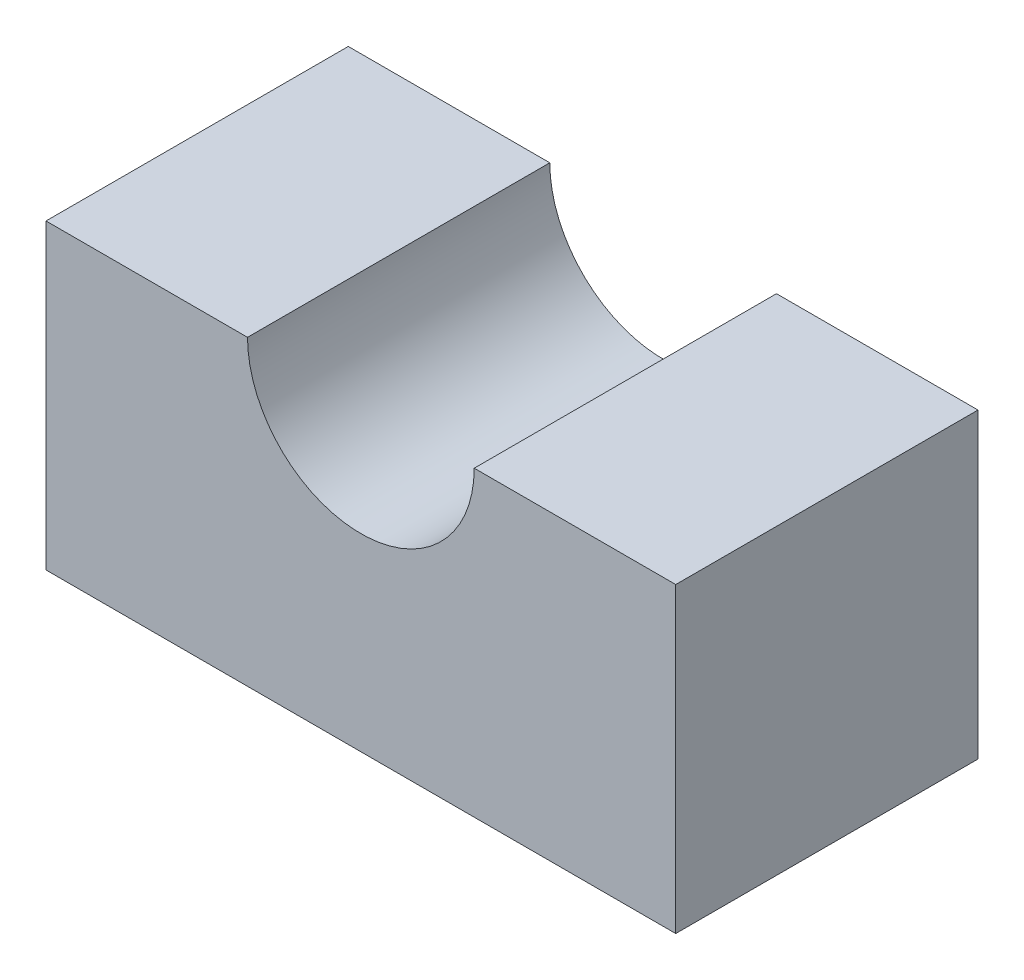
ISO-10303-21;
HEADER;
FILE_DESCRIPTION(('STEP AP214'),'2;1');
FILE_NAME('part.step','',(''),(''),'','','');
FILE_SCHEMA(('AUTOMOTIVE_DESIGN { 1 0 10303 214 1 1 1 1 }'));
ENDSEC;
DATA;
#1=APPLICATION_CONTEXT('core data for automotive mechanical design processes');
#2=APPLICATION_PROTOCOL_DEFINITION('international standard','automotive_design',2000,#1);
#3=PRODUCT_CONTEXT('',#1,'mechanical');
#4=PRODUCT('Part','Part','',(#3));
#5=PRODUCT_RELATED_PRODUCT_CATEGORY('part','',(#4));
#6=PRODUCT_DEFINITION_FORMATION('','',#4);
#7=PRODUCT_DEFINITION_CONTEXT('part definition',#1,'design');
#8=PRODUCT_DEFINITION('design','',#6,#7);
#9=PRODUCT_DEFINITION_SHAPE('','',#8);
#10=(LENGTH_UNIT() NAMED_UNIT(*) SI_UNIT(.MILLI.,.METRE.));
#11=(NAMED_UNIT(*) PLANE_ANGLE_UNIT() SI_UNIT($,.RADIAN.));
#12=(NAMED_UNIT(*) SI_UNIT($,.STERADIAN.) SOLID_ANGLE_UNIT());
#13=UNCERTAINTY_MEASURE_WITH_UNIT(LENGTH_MEASURE(1.E-05),#10,'distance_accuracy_value','');
#14=(GEOMETRIC_REPRESENTATION_CONTEXT(3) GLOBAL_UNCERTAINTY_ASSIGNED_CONTEXT((#13)) GLOBAL_UNIT_ASSIGNED_CONTEXT((#10,
#11,#12)) REPRESENTATION_CONTEXT('',''));
#15=CARTESIAN_POINT('',(0.,0.,0.));
#16=DIRECTION('',(0.,0.,1.));
#17=DIRECTION('',(1.,0.,0.));
#18=AXIS2_PLACEMENT_3D('',#15,#16,#17);
#19=CARTESIAN_POINT('',(-12.5,12.,6.));
#20=DIRECTION('',(1.,0.,0.));
#21=DIRECTION('',(0.,0.,-1.));
#22=AXIS2_PLACEMENT_3D('',#19,#20,#21);
#23=PLANE('',#22);
#24=DIRECTION('',(0.,-1.,0.));
#25=VECTOR('',#24,1.);
#26=CARTESIAN_POINT('',(-12.5,12.,-6.));
#27=LINE('',#26,#25);
#28=CARTESIAN_POINT('',(-12.5,12.,-6.));
#29=VERTEX_POINT('',#28);
#30=CARTESIAN_POINT('',(-12.5,0.,-6.));
#31=VERTEX_POINT('',#30);
#32=EDGE_CURVE('E122',#29,#31,#27,.T.);
#33=ORIENTED_EDGE('',*,*,#32,.T.);
#34=DIRECTION('',(0.,0.,-1.));
#35=VECTOR('',#34,1.);
#36=CARTESIAN_POINT('',(-12.5,0.,6.));
#37=LINE('',#36,#35);
#38=CARTESIAN_POINT('',(-12.5,0.,6.));
#39=VERTEX_POINT('',#38);
#40=EDGE_CURVE('E11',#39,#31,#37,.T.);
#41=ORIENTED_EDGE('',*,*,#40,.F.);
#42=DIRECTION('',(0.,-1.,0.));
#43=VECTOR('',#42,1.);
#44=CARTESIAN_POINT('',(-12.5,12.,6.));
#45=LINE('',#44,#43);
#46=CARTESIAN_POINT('',(-12.5,12.,6.));
#47=VERTEX_POINT('',#46);
#48=EDGE_CURVE('E132',#47,#39,#45,.T.);
#49=ORIENTED_EDGE('',*,*,#48,.F.);
#50=DIRECTION('',(0.,0.,-1.));
#51=VECTOR('',#50,1.);
#52=CARTESIAN_POINT('',(-12.5,12.,6.));
#53=LINE('',#52,#51);
#54=EDGE_CURVE('E118',#47,#29,#53,.T.);
#55=ORIENTED_EDGE('',*,*,#54,.T.);
#56=EDGE_LOOP('',(#33,#41,#49,#55));
#57=FACE_BOUND('',#56,.T.);
#58=ADVANCED_FACE('F38',(#57),#23,.F.);
#59=CARTESIAN_POINT('',(-12.5,0.,6.));
#60=DIRECTION('',(0.,1.,0.));
#61=DIRECTION('',(0.,0.,1.));
#62=AXIS2_PLACEMENT_3D('',#59,#60,#61);
#63=PLANE('',#62);
#64=DIRECTION('',(1.,0.,0.));
#65=VECTOR('',#64,1.);
#66=CARTESIAN_POINT('',(-12.5,0.,-6.));
#67=LINE('',#66,#65);
#68=CARTESIAN_POINT('',(12.5,0.,-6.));
#69=VERTEX_POINT('',#68);
#70=EDGE_CURVE('E125',#31,#69,#67,.T.);
#71=ORIENTED_EDGE('',*,*,#70,.T.);
#72=DIRECTION('',(0.,0.,-1.));
#73=VECTOR('',#72,1.);
#74=CARTESIAN_POINT('',(12.5,0.,6.));
#75=LINE('',#74,#73);
#76=CARTESIAN_POINT('',(12.5,0.,6.));
#77=VERTEX_POINT('',#76);
#78=EDGE_CURVE('E46',#77,#69,#75,.T.);
#79=ORIENTED_EDGE('',*,*,#78,.F.);
#80=DIRECTION('',(1.,0.,0.));
#81=VECTOR('',#80,1.);
#82=CARTESIAN_POINT('',(-12.5,0.,6.));
#83=LINE('',#82,#81);
#84=EDGE_CURVE('E91',#39,#77,#83,.T.);
#85=ORIENTED_EDGE('',*,*,#84,.F.);
#86=ORIENTED_EDGE('',*,*,#40,.T.);
#87=EDGE_LOOP('',(#71,#79,#85,#86));
#88=FACE_BOUND('',#87,.T.);
#89=ADVANCED_FACE('F156',(#88),#63,.F.);
#90=CARTESIAN_POINT('',(12.5,0.,6.));
#91=DIRECTION('',(-1.,0.,0.));
#92=DIRECTION('',(0.,0.,1.));
#93=AXIS2_PLACEMENT_3D('',#90,#91,#92);
#94=PLANE('',#93);
#95=DIRECTION('',(0.,1.,0.));
#96=VECTOR('',#95,1.);
#97=CARTESIAN_POINT('',(12.5,0.,-6.));
#98=LINE('',#97,#96);
#99=CARTESIAN_POINT('',(12.5,12.,-6.));
#100=VERTEX_POINT('',#99);
#101=EDGE_CURVE('E127',#69,#100,#98,.T.);
#102=ORIENTED_EDGE('',*,*,#101,.T.);
#103=DIRECTION('',(0.,0.,-1.));
#104=VECTOR('',#103,1.);
#105=CARTESIAN_POINT('',(12.5,12.,6.));
#106=LINE('',#105,#104);
#107=CARTESIAN_POINT('',(12.5,12.,6.));
#108=VERTEX_POINT('',#107);
#109=EDGE_CURVE('E113',#108,#100,#106,.T.);
#110=ORIENTED_EDGE('',*,*,#109,.F.);
#111=DIRECTION('',(0.,1.,0.));
#112=VECTOR('',#111,1.);
#113=CARTESIAN_POINT('',(12.5,0.,6.));
#114=LINE('',#113,#112);
#115=EDGE_CURVE('E104',#77,#108,#114,.T.);
#116=ORIENTED_EDGE('',*,*,#115,.F.);
#117=ORIENTED_EDGE('',*,*,#78,.T.);
#118=EDGE_LOOP('',(#102,#110,#116,#117));
#119=FACE_BOUND('',#118,.T.);
#120=ADVANCED_FACE('F138',(#119),#94,.F.);
#121=CARTESIAN_POINT('',(12.5,12.,6.));
#122=DIRECTION('',(0.,-1.,0.));
#123=DIRECTION('',(1.,0.,0.));
#124=AXIS2_PLACEMENT_3D('',#121,#122,#123);
#125=PLANE('',#124);
#126=DIRECTION('',(-1.,0.,0.));
#127=VECTOR('',#126,1.);
#128=CARTESIAN_POINT('',(12.5,12.,-6.));
#129=LINE('',#128,#127);
#130=CARTESIAN_POINT('',(4.5,12.,-6.));
#131=VERTEX_POINT('',#130);
#132=EDGE_CURVE('E112',#100,#131,#129,.T.);
#133=ORIENTED_EDGE('',*,*,#132,.T.);
#134=DIRECTION('',(0.,0.,-1.));
#135=VECTOR('',#134,1.);
#136=CARTESIAN_POINT('',(4.5,12.,6.));
#137=LINE('',#136,#135);
#138=CARTESIAN_POINT('',(4.5,12.,6.));
#139=VERTEX_POINT('',#138);
#140=EDGE_CURVE('E109',#139,#131,#137,.T.);
#141=ORIENTED_EDGE('',*,*,#140,.F.);
#142=DIRECTION('',(-1.,0.,0.));
#143=VECTOR('',#142,1.);
#144=CARTESIAN_POINT('',(12.5,12.,6.));
#145=LINE('',#144,#143);
#146=EDGE_CURVE('E98',#108,#139,#145,.T.);
#147=ORIENTED_EDGE('',*,*,#146,.F.);
#148=ORIENTED_EDGE('',*,*,#109,.T.);
#149=EDGE_LOOP('',(#133,#141,#147,#148));
#150=FACE_BOUND('',#149,.T.);
#151=ADVANCED_FACE('F110',(#150),#125,.F.);
#152=CARTESIAN_POINT('',(0.,12.,6.));
#153=DIRECTION('',(0.,0.,-1.));
#154=DIRECTION('',(-1.,0.,0.));
#155=AXIS2_PLACEMENT_3D('',#152,#153,#154);
#156=CYLINDRICAL_SURFACE('',#155,4.5);
#157=CARTESIAN_POINT('',(0.,12.,-6.));
#158=DIRECTION('',(0.,0.,-1.));
#159=DIRECTION('',(1.,0.,0.));
#160=AXIS2_PLACEMENT_3D('',#157,#158,#159);
#161=CIRCLE('',#160,4.5);
#162=CARTESIAN_POINT('',(-4.5,12.,-6.));
#163=VERTEX_POINT('',#162);
#164=EDGE_CURVE('E77',#131,#163,#161,.T.);
#165=ORIENTED_EDGE('',*,*,#164,.T.);
#166=DIRECTION('',(0.,0.,-1.));
#167=VECTOR('',#166,1.);
#168=CARTESIAN_POINT('',(-4.5,12.,6.));
#169=LINE('',#168,#167);
#170=CARTESIAN_POINT('',(-4.5,12.,6.));
#171=VERTEX_POINT('',#170);
#172=EDGE_CURVE('E114',#171,#163,#169,.T.);
#173=ORIENTED_EDGE('',*,*,#172,.F.);
#174=CARTESIAN_POINT('',(0.,12.,6.));
#175=DIRECTION('',(0.,0.,-1.));
#176=DIRECTION('',(1.,0.,0.));
#177=AXIS2_PLACEMENT_3D('',#174,#175,#176);
#178=CIRCLE('',#177,4.5);
#179=EDGE_CURVE('E102',#139,#171,#178,.T.);
#180=ORIENTED_EDGE('',*,*,#179,.F.);
#181=ORIENTED_EDGE('',*,*,#140,.T.);
#182=EDGE_LOOP('',(#165,#173,#180,#181));
#183=FACE_BOUND('',#182,.T.);
#184=ADVANCED_FACE('F116',(#183),#156,.F.);
#185=CARTESIAN_POINT('',(-4.5,12.,6.));
#186=DIRECTION('',(0.,-1.,0.));
#187=DIRECTION('',(1.,0.,0.));
#188=AXIS2_PLACEMENT_3D('',#185,#186,#187);
#189=PLANE('',#188);
#190=DIRECTION('',(-1.,0.,0.));
#191=VECTOR('',#190,1.);
#192=CARTESIAN_POINT('',(-4.5,12.,-6.));
#193=LINE('',#192,#191);
#194=EDGE_CURVE('E83',#163,#29,#193,.T.);
#195=ORIENTED_EDGE('',*,*,#194,.T.);
#196=ORIENTED_EDGE('',*,*,#54,.F.);
#197=DIRECTION('',(-1.,0.,0.));
#198=VECTOR('',#197,1.);
#199=CARTESIAN_POINT('',(-4.5,12.,6.));
#200=LINE('',#199,#198);
#201=EDGE_CURVE('E54',#171,#47,#200,.T.);
#202=ORIENTED_EDGE('',*,*,#201,.F.);
#203=ORIENTED_EDGE('',*,*,#172,.T.);
#204=EDGE_LOOP('',(#195,#196,#202,#203));
#205=FACE_BOUND('',#204,.T.);
#206=ADVANCED_FACE('F145',(#205),#189,.F.);
#207=CARTESIAN_POINT('',(0.,12.,6.));
#208=DIRECTION('',(0.,0.,1.));
#209=DIRECTION('',(1.,0.,0.));
#210=AXIS2_PLACEMENT_3D('',#207,#208,#209);
#211=PLANE('',#210);
#212=ORIENTED_EDGE('',*,*,#48,.T.);
#213=ORIENTED_EDGE('',*,*,#84,.T.);
#214=ORIENTED_EDGE('',*,*,#115,.T.);
#215=ORIENTED_EDGE('',*,*,#146,.T.);
#216=ORIENTED_EDGE('',*,*,#179,.T.);
#217=ORIENTED_EDGE('',*,*,#201,.T.);
#218=EDGE_LOOP('',(#212,#213,#214,#215,#216,#217));
#219=FACE_BOUND('',#218,.T.);
#220=ADVANCED_FACE('F100',(#219),#211,.T.);
#221=CARTESIAN_POINT('',(0.,12.,-6.));
#222=DIRECTION('',(0.,0.,1.));
#223=DIRECTION('',(1.,0.,0.));
#224=AXIS2_PLACEMENT_3D('',#221,#222,#223);
#225=PLANE('',#224);
#226=ORIENTED_EDGE('',*,*,#32,.F.);
#227=ORIENTED_EDGE('',*,*,#194,.F.);
#228=ORIENTED_EDGE('',*,*,#164,.F.);
#229=ORIENTED_EDGE('',*,*,#132,.F.);
#230=ORIENTED_EDGE('',*,*,#101,.F.);
#231=ORIENTED_EDGE('',*,*,#70,.F.);
#232=EDGE_LOOP('',(#226,#227,#228,#229,#230,#231));
#233=FACE_BOUND('',#232,.T.);
#234=ADVANCED_FACE('F141',(#233),#225,.F.);
#235=CLOSED_SHELL('',(#58,#89,#120,#151,#184,#206,#220,#234));
#236=MANIFOLD_SOLID_BREP('B2',#235);
#237=ADVANCED_BREP_SHAPE_REPRESENTATION('',(#18,#236),#14);
#238=SHAPE_DEFINITION_REPRESENTATION(#9,#237);
ENDSEC;
END-ISO-10303-21;
